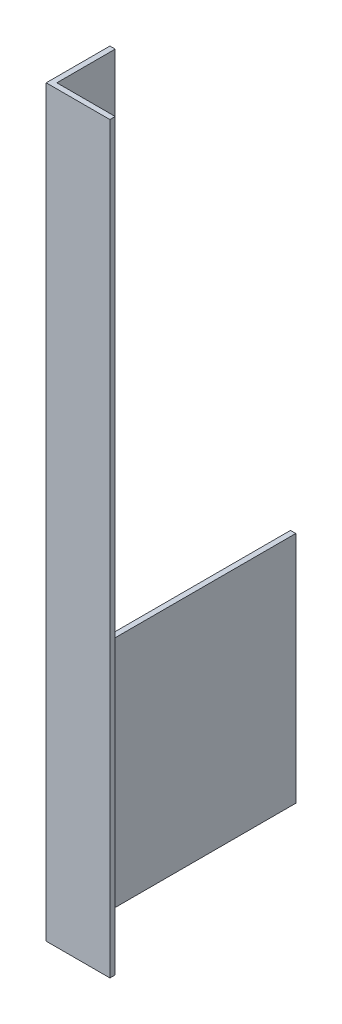
ISO-10303-21;
HEADER;
FILE_DESCRIPTION(('STEP AP214'),'2;1');
FILE_NAME('part.step','',(''),(''),'','','');
FILE_SCHEMA(('AUTOMOTIVE_DESIGN { 1 0 10303 214 1 1 1 1 }'));
ENDSEC;
DATA;
#1=APPLICATION_CONTEXT('core data for automotive mechanical design processes');
#2=APPLICATION_PROTOCOL_DEFINITION('international standard','automotive_design',2000,#1);
#3=PRODUCT_CONTEXT('',#1,'mechanical');
#4=PRODUCT('Part','Part','',(#3));
#5=PRODUCT_RELATED_PRODUCT_CATEGORY('part','',(#4));
#6=PRODUCT_DEFINITION_FORMATION('','',#4);
#7=PRODUCT_DEFINITION_CONTEXT('part definition',#1,'design');
#8=PRODUCT_DEFINITION('design','',#6,#7);
#9=PRODUCT_DEFINITION_SHAPE('','',#8);
#10=(LENGTH_UNIT() NAMED_UNIT(*) SI_UNIT(.MILLI.,.METRE.));
#11=(NAMED_UNIT(*) PLANE_ANGLE_UNIT() SI_UNIT($,.RADIAN.));
#12=(NAMED_UNIT(*) SI_UNIT($,.STERADIAN.) SOLID_ANGLE_UNIT());
#13=UNCERTAINTY_MEASURE_WITH_UNIT(LENGTH_MEASURE(1.E-05),#10,'distance_accuracy_value','');
#14=(GEOMETRIC_REPRESENTATION_CONTEXT(3) GLOBAL_UNCERTAINTY_ASSIGNED_CONTEXT((#13)) GLOBAL_UNIT_ASSIGNED_CONTEXT((#10,
#11,#12)) REPRESENTATION_CONTEXT('',''));
#15=CARTESIAN_POINT('',(0.,0.,0.));
#16=DIRECTION('',(0.,0.,1.));
#17=DIRECTION('',(1.,0.,0.));
#18=AXIS2_PLACEMENT_3D('',#15,#16,#17);
#19=CARTESIAN_POINT('',(0.,222.25,0.));
#20=DIRECTION('',(1.,0.,0.));
#21=DIRECTION('',(0.,0.,-1.));
#22=AXIS2_PLACEMENT_3D('',#19,#20,#21);
#23=PLANE('',#22);
#24=DIRECTION('',(0.,0.,1.));
#25=VECTOR('',#24,1.);
#26=CARTESIAN_POINT('',(0.,-222.25,0.));
#27=LINE('',#26,#25);
#28=CARTESIAN_POINT('',(0.,-222.25,-146.05));
#29=VERTEX_POINT('',#28);
#30=CARTESIAN_POINT('',(0.,-222.25,0.));
#31=VERTEX_POINT('',#30);
#32=EDGE_CURVE('E121',#29,#31,#27,.T.);
#33=ORIENTED_EDGE('',*,*,#32,.T.);
#34=DIRECTION('',(0.,-1.,0.));
#35=VECTOR('',#34,1.);
#36=CARTESIAN_POINT('',(0.,222.25,0.));
#37=LINE('',#36,#35);
#38=CARTESIAN_POINT('',(0.,222.25,0.));
#39=VERTEX_POINT('',#38);
#40=EDGE_CURVE('E11',#39,#31,#37,.T.);
#41=ORIENTED_EDGE('',*,*,#40,.F.);
#42=DIRECTION('',(0.,0.,1.));
#43=VECTOR('',#42,1.);
#44=CARTESIAN_POINT('',(0.,222.25,0.));
#45=LINE('',#44,#43);
#46=CARTESIAN_POINT('',(1.28359534705172E-13,222.25,-38.1));
#47=VERTEX_POINT('',#46);
#48=EDGE_CURVE('E132',#47,#39,#45,.T.);
#49=ORIENTED_EDGE('',*,*,#48,.F.);
#50=DIRECTION('',(0.,-1.,0.));
#51=VECTOR('',#50,1.);
#52=CARTESIAN_POINT('',(1.28359534705172E-13,222.25,-38.1));
#53=LINE('',#52,#51);
#54=CARTESIAN_POINT('',(1.28359534705172E-13,-82.55,-38.1));
#55=VERTEX_POINT('',#54);
#56=EDGE_CURVE('E117',#47,#55,#53,.T.);
#57=ORIENTED_EDGE('',*,*,#56,.T.);
#58=DIRECTION('',(0.,0.,1.));
#59=VECTOR('',#58,1.);
#60=CARTESIAN_POINT('',(0.,-82.55,-38.1));
#61=LINE('',#60,#59);
#62=CARTESIAN_POINT('',(0.,-82.55,-146.05));
#63=VERTEX_POINT('',#62);
#64=EDGE_CURVE('E47',#63,#55,#61,.T.);
#65=ORIENTED_EDGE('',*,*,#64,.F.);
#66=DIRECTION('',(0.,1.,0.));
#67=VECTOR('',#66,1.);
#68=CARTESIAN_POINT('',(0.,-222.25,-146.05));
#69=LINE('',#68,#67);
#70=EDGE_CURVE('E161',#29,#63,#69,.T.);
#71=ORIENTED_EDGE('',*,*,#70,.F.);
#72=EDGE_LOOP('',(#33,#41,#49,#57,#65,#71));
#73=FACE_BOUND('',#72,.T.);
#74=ADVANCED_FACE('F33',(#73),#23,.F.);
#75=CARTESIAN_POINT('',(0.,222.25,0.));
#76=DIRECTION('',(0.,0.,-1.));
#77=DIRECTION('',(-1.,0.,0.));
#78=AXIS2_PLACEMENT_3D('',#75,#76,#77);
#79=PLANE('',#78);
#80=DIRECTION('',(1.,0.,0.));
#81=VECTOR('',#80,1.);
#82=CARTESIAN_POINT('',(0.,-222.25,0.));
#83=LINE('',#82,#81);
#84=CARTESIAN_POINT('',(38.1,-222.25,0.));
#85=VERTEX_POINT('',#84);
#86=EDGE_CURVE('E124',#31,#85,#83,.T.);
#87=ORIENTED_EDGE('',*,*,#86,.T.);
#88=DIRECTION('',(0.,-1.,0.));
#89=VECTOR('',#88,1.);
#90=CARTESIAN_POINT('',(38.1,222.25,0.));
#91=LINE('',#90,#89);
#92=CARTESIAN_POINT('',(38.1,222.25,0.));
#93=VERTEX_POINT('',#92);
#94=EDGE_CURVE('E40',#93,#85,#91,.T.);
#95=ORIENTED_EDGE('',*,*,#94,.F.);
#96=DIRECTION('',(1.,0.,0.));
#97=VECTOR('',#96,1.);
#98=CARTESIAN_POINT('',(0.,222.25,0.));
#99=LINE('',#98,#97);
#100=EDGE_CURVE('E86',#39,#93,#99,.T.);
#101=ORIENTED_EDGE('',*,*,#100,.F.);
#102=ORIENTED_EDGE('',*,*,#40,.T.);
#103=EDGE_LOOP('',(#87,#95,#101,#102));
#104=FACE_BOUND('',#103,.T.);
#105=ADVANCED_FACE('F175',(#104),#79,.F.);
#106=CARTESIAN_POINT('',(38.1,222.25,0.));
#107=DIRECTION('',(-1.,0.,0.));
#108=DIRECTION('',(0.,0.,1.));
#109=AXIS2_PLACEMENT_3D('',#106,#107,#108);
#110=PLANE('',#109);
#111=DIRECTION('',(0.,0.,-1.));
#112=VECTOR('',#111,1.);
#113=CARTESIAN_POINT('',(38.1,-222.25,0.));
#114=LINE('',#113,#112);
#115=CARTESIAN_POINT('',(38.1,-222.25,-3.175));
#116=VERTEX_POINT('',#115);
#117=EDGE_CURVE('E127',#85,#116,#114,.T.);
#118=ORIENTED_EDGE('',*,*,#117,.T.);
#119=DIRECTION('',(0.,-1.,0.));
#120=VECTOR('',#119,1.);
#121=CARTESIAN_POINT('',(38.1,222.25,-3.175));
#122=LINE('',#121,#120);
#123=CARTESIAN_POINT('',(38.1,222.25,-3.175));
#124=VERTEX_POINT('',#123);
#125=EDGE_CURVE('E110',#124,#116,#122,.T.);
#126=ORIENTED_EDGE('',*,*,#125,.F.);
#127=DIRECTION('',(0.,0.,-1.));
#128=VECTOR('',#127,1.);
#129=CARTESIAN_POINT('',(38.1,222.25,0.));
#130=LINE('',#129,#128);
#131=EDGE_CURVE('E102',#93,#124,#130,.T.);
#132=ORIENTED_EDGE('',*,*,#131,.F.);
#133=ORIENTED_EDGE('',*,*,#94,.T.);
#134=EDGE_LOOP('',(#118,#126,#132,#133));
#135=FACE_BOUND('',#134,.T.);
#136=ADVANCED_FACE('F139',(#135),#110,.F.);
#137=CARTESIAN_POINT('',(3.17500000000001,222.25,-3.175));
#138=DIRECTION('',(0.,0.,1.));
#139=DIRECTION('',(1.,0.,0.));
#140=AXIS2_PLACEMENT_3D('',#137,#138,#139);
#141=PLANE('',#140);
#142=DIRECTION('',(-1.,0.,0.));
#143=VECTOR('',#142,1.);
#144=CARTESIAN_POINT('',(3.17500000000001,-222.25,-3.175));
#145=LINE('',#144,#143);
#146=CARTESIAN_POINT('',(3.17500000000001,-222.25,-3.175));
#147=VERTEX_POINT('',#146);
#148=EDGE_CURVE('E78',#116,#147,#145,.T.);
#149=ORIENTED_EDGE('',*,*,#148,.T.);
#150=DIRECTION('',(0.,-1.,0.));
#151=VECTOR('',#150,1.);
#152=CARTESIAN_POINT('',(3.17500000000001,222.25,-3.175));
#153=LINE('',#152,#151);
#154=CARTESIAN_POINT('',(3.17500000000001,222.25,-3.175));
#155=VERTEX_POINT('',#154);
#156=EDGE_CURVE('E105',#155,#147,#153,.T.);
#157=ORIENTED_EDGE('',*,*,#156,.F.);
#158=DIRECTION('',(-1.,0.,0.));
#159=VECTOR('',#158,1.);
#160=CARTESIAN_POINT('',(3.17500000000001,222.25,-3.175));
#161=LINE('',#160,#159);
#162=EDGE_CURVE('E96',#124,#155,#161,.T.);
#163=ORIENTED_EDGE('',*,*,#162,.F.);
#164=ORIENTED_EDGE('',*,*,#125,.T.);
#165=EDGE_LOOP('',(#149,#157,#163,#164));
#166=FACE_BOUND('',#165,.T.);
#167=ADVANCED_FACE('F106',(#166),#141,.F.);
#168=CARTESIAN_POINT('',(3.17500000000013,222.25,-38.1));
#169=DIRECTION('',(-1.,0.,0.));
#170=DIRECTION('',(0.,0.,1.));
#171=AXIS2_PLACEMENT_3D('',#168,#169,#170);
#172=PLANE('',#171);
#173=DIRECTION('',(0.,0.,-1.));
#174=VECTOR('',#173,1.);
#175=CARTESIAN_POINT('',(3.17500000000013,-222.25,-38.1));
#176=LINE('',#175,#174);
#177=CARTESIAN_POINT('',(3.175,-222.25,-146.05));
#178=VERTEX_POINT('',#177);
#179=EDGE_CURVE('E130',#147,#178,#176,.T.);
#180=ORIENTED_EDGE('',*,*,#179,.T.);
#181=DIRECTION('',(0.,1.,0.));
#182=VECTOR('',#181,1.);
#183=CARTESIAN_POINT('',(3.175,-222.25,-146.05));
#184=LINE('',#183,#182);
#185=CARTESIAN_POINT('',(3.175,-82.55,-146.05));
#186=VERTEX_POINT('',#185);
#187=EDGE_CURVE('E149',#178,#186,#184,.T.);
#188=ORIENTED_EDGE('',*,*,#187,.T.);
#189=DIRECTION('',(0.,0.,1.));
#190=VECTOR('',#189,1.);
#191=CARTESIAN_POINT('',(3.175,-82.55,-38.1));
#192=LINE('',#191,#190);
#193=CARTESIAN_POINT('',(3.175,-82.55,-38.1));
#194=VERTEX_POINT('',#193);
#195=EDGE_CURVE('E167',#186,#194,#192,.T.);
#196=ORIENTED_EDGE('',*,*,#195,.T.);
#197=DIRECTION('',(0.,-1.,0.));
#198=VECTOR('',#197,1.);
#199=CARTESIAN_POINT('',(3.17500000000013,222.25,-38.1));
#200=LINE('',#199,#198);
#201=CARTESIAN_POINT('',(3.17500000000013,222.25,-38.1));
#202=VERTEX_POINT('',#201);
#203=EDGE_CURVE('E111',#202,#194,#200,.T.);
#204=ORIENTED_EDGE('',*,*,#203,.F.);
#205=DIRECTION('',(0.,0.,-1.));
#206=VECTOR('',#205,1.);
#207=CARTESIAN_POINT('',(3.17500000000013,222.25,-38.1));
#208=LINE('',#207,#206);
#209=EDGE_CURVE('E99',#155,#202,#208,.T.);
#210=ORIENTED_EDGE('',*,*,#209,.F.);
#211=ORIENTED_EDGE('',*,*,#156,.T.);
#212=EDGE_LOOP('',(#180,#188,#196,#204,#210,#211));
#213=FACE_BOUND('',#212,.T.);
#214=ADVANCED_FACE('F113',(#213),#172,.F.);
#215=CARTESIAN_POINT('',(1.28359534705172E-13,222.25,-38.1));
#216=DIRECTION('',(0.,0.,1.));
#217=DIRECTION('',(1.,0.,0.));
#218=AXIS2_PLACEMENT_3D('',#215,#216,#217);
#219=PLANE('',#218);
#220=ORIENTED_EDGE('',*,*,#203,.T.);
#221=DIRECTION('',(-1.,0.,0.));
#222=VECTOR('',#221,1.);
#223=CARTESIAN_POINT('',(3.175,-82.55,-38.1));
#224=LINE('',#223,#222);
#225=EDGE_CURVE('E170',#194,#55,#224,.T.);
#226=ORIENTED_EDGE('',*,*,#225,.T.);
#227=ORIENTED_EDGE('',*,*,#56,.F.);
#228=DIRECTION('',(-1.,0.,0.));
#229=VECTOR('',#228,1.);
#230=CARTESIAN_POINT('',(1.28359534705172E-13,222.25,-38.1));
#231=LINE('',#230,#229);
#232=EDGE_CURVE('E56',#202,#47,#231,.T.);
#233=ORIENTED_EDGE('',*,*,#232,.F.);
#234=EDGE_LOOP('',(#220,#226,#227,#233));
#235=FACE_BOUND('',#234,.T.);
#236=ADVANCED_FACE('F187',(#235),#219,.F.);
#237=CARTESIAN_POINT('',(0.,222.25,0.));
#238=DIRECTION('',(0.,-1.,0.));
#239=DIRECTION('',(0.,0.,-1.));
#240=AXIS2_PLACEMENT_3D('',#237,#238,#239);
#241=PLANE('',#240);
#242=ORIENTED_EDGE('',*,*,#48,.T.);
#243=ORIENTED_EDGE('',*,*,#100,.T.);
#244=ORIENTED_EDGE('',*,*,#131,.T.);
#245=ORIENTED_EDGE('',*,*,#162,.T.);
#246=ORIENTED_EDGE('',*,*,#209,.T.);
#247=ORIENTED_EDGE('',*,*,#232,.T.);
#248=EDGE_LOOP('',(#242,#243,#244,#245,#246,#247));
#249=FACE_BOUND('',#248,.T.);
#250=ADVANCED_FACE('F97',(#249),#241,.F.);
#251=CARTESIAN_POINT('',(0.,-222.25,0.));
#252=DIRECTION('',(0.,-1.,0.));
#253=DIRECTION('',(0.,0.,-1.));
#254=AXIS2_PLACEMENT_3D('',#251,#252,#253);
#255=PLANE('',#254);
#256=ORIENTED_EDGE('',*,*,#32,.F.);
#257=DIRECTION('',(-1.,0.,0.));
#258=VECTOR('',#257,1.);
#259=CARTESIAN_POINT('',(3.175,-222.25,-146.05));
#260=LINE('',#259,#258);
#261=EDGE_CURVE('E125',#178,#29,#260,.T.);
#262=ORIENTED_EDGE('',*,*,#261,.F.);
#263=ORIENTED_EDGE('',*,*,#179,.F.);
#264=ORIENTED_EDGE('',*,*,#148,.F.);
#265=ORIENTED_EDGE('',*,*,#117,.F.);
#266=ORIENTED_EDGE('',*,*,#86,.F.);
#267=EDGE_LOOP('',(#256,#262,#263,#264,#265,#266));
#268=FACE_BOUND('',#267,.T.);
#269=ADVANCED_FACE('F142',(#268),#255,.T.);
#270=CARTESIAN_POINT('',(3.175,-222.25,-146.05));
#271=DIRECTION('',(0.,0.,1.));
#272=DIRECTION('',(1.,0.,0.));
#273=AXIS2_PLACEMENT_3D('',#270,#271,#272);
#274=PLANE('',#273);
#275=ORIENTED_EDGE('',*,*,#70,.T.);
#276=DIRECTION('',(-1.,0.,0.));
#277=VECTOR('',#276,1.);
#278=CARTESIAN_POINT('',(3.175,-82.55,-146.05));
#279=LINE('',#278,#277);
#280=EDGE_CURVE('E162',#186,#63,#279,.T.);
#281=ORIENTED_EDGE('',*,*,#280,.F.);
#282=ORIENTED_EDGE('',*,*,#187,.F.);
#283=ORIENTED_EDGE('',*,*,#261,.T.);
#284=EDGE_LOOP('',(#275,#281,#282,#283));
#285=FACE_BOUND('',#284,.T.);
#286=ADVANCED_FACE('F160',(#285),#274,.F.);
#287=CARTESIAN_POINT('',(3.175,-82.55,-38.1));
#288=DIRECTION('',(0.,-1.,0.));
#289=DIRECTION('',(0.,0.,-1.));
#290=AXIS2_PLACEMENT_3D('',#287,#288,#289);
#291=PLANE('',#290);
#292=ORIENTED_EDGE('',*,*,#64,.T.);
#293=ORIENTED_EDGE('',*,*,#225,.F.);
#294=ORIENTED_EDGE('',*,*,#195,.F.);
#295=ORIENTED_EDGE('',*,*,#280,.T.);
#296=EDGE_LOOP('',(#292,#293,#294,#295));
#297=FACE_BOUND('',#296,.T.);
#298=ADVANCED_FACE('F197',(#297),#291,.F.);
#299=CLOSED_SHELL('',(#74,#105,#136,#167,#214,#236,#250,#269,#286,#298));
#300=MANIFOLD_SOLID_BREP('B2',#299);
#301=ADVANCED_BREP_SHAPE_REPRESENTATION('',(#18,#300),#14);
#302=SHAPE_DEFINITION_REPRESENTATION(#9,#301);
ENDSEC;
END-ISO-10303-21;
